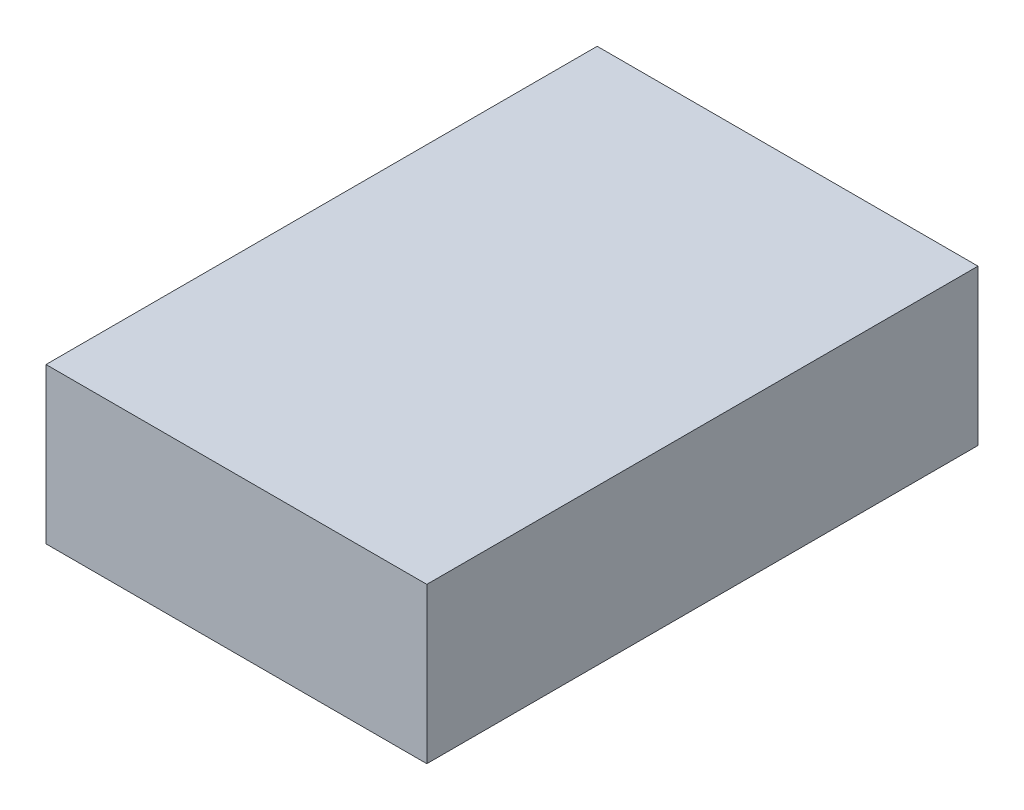
ISO-10303-21;
HEADER;
FILE_DESCRIPTION(('STEP AP214'),'2;1');
FILE_NAME('part.step','',(''),(''),'','','');
FILE_SCHEMA(('AUTOMOTIVE_DESIGN { 1 0 10303 214 1 1 1 1 }'));
ENDSEC;
DATA;
#1=APPLICATION_CONTEXT('core data for automotive mechanical design processes');
#2=APPLICATION_PROTOCOL_DEFINITION('international standard','automotive_design',2000,#1);
#3=PRODUCT_CONTEXT('',#1,'mechanical');
#4=PRODUCT('Part','Part','',(#3));
#5=PRODUCT_RELATED_PRODUCT_CATEGORY('part','',(#4));
#6=PRODUCT_DEFINITION_FORMATION('','',#4);
#7=PRODUCT_DEFINITION_CONTEXT('part definition',#1,'design');
#8=PRODUCT_DEFINITION('design','',#6,#7);
#9=PRODUCT_DEFINITION_SHAPE('','',#8);
#10=(LENGTH_UNIT() NAMED_UNIT(*) SI_UNIT(.MILLI.,.METRE.));
#11=(NAMED_UNIT(*) PLANE_ANGLE_UNIT() SI_UNIT($,.RADIAN.));
#12=(NAMED_UNIT(*) SI_UNIT($,.STERADIAN.) SOLID_ANGLE_UNIT());
#13=UNCERTAINTY_MEASURE_WITH_UNIT(LENGTH_MEASURE(1.E-05),#10,'distance_accuracy_value','');
#14=(GEOMETRIC_REPRESENTATION_CONTEXT(3) GLOBAL_UNCERTAINTY_ASSIGNED_CONTEXT((#13)) GLOBAL_UNIT_ASSIGNED_CONTEXT((#10,
#11,#12)) REPRESENTATION_CONTEXT('',''));
#15=CARTESIAN_POINT('',(0.,0.,0.));
#16=DIRECTION('',(0.,0.,1.));
#17=DIRECTION('',(1.,0.,0.));
#18=AXIS2_PLACEMENT_3D('',#15,#16,#17);
#19=CARTESIAN_POINT('',(-19.,15.4999944,27.5));
#20=DIRECTION('',(-1.,0.,0.));
#21=DIRECTION('',(0.,0.,1.));
#22=AXIS2_PLACEMENT_3D('',#19,#20,#21);
#23=PLANE('',#22);
#24=DIRECTION('',(0.,0.,-1.));
#25=VECTOR('',#24,1.);
#26=CARTESIAN_POINT('',(-19.,0.,27.5));
#27=LINE('',#26,#25);
#28=CARTESIAN_POINT('',(-19.,0.,27.5));
#29=VERTEX_POINT('',#28);
#30=CARTESIAN_POINT('',(-19.,0.,-27.5));
#31=VERTEX_POINT('',#30);
#32=EDGE_CURVE('E110',#29,#31,#27,.T.);
#33=ORIENTED_EDGE('',*,*,#32,.F.);
#34=DIRECTION('',(0.,-1.,0.));
#35=VECTOR('',#34,1.);
#36=CARTESIAN_POINT('',(-19.,15.4999944,27.5));
#37=LINE('',#36,#35);
#38=CARTESIAN_POINT('',(-19.,15.4999944,27.5));
#39=VERTEX_POINT('',#38);
#40=EDGE_CURVE('E11',#39,#29,#37,.T.);
#41=ORIENTED_EDGE('',*,*,#40,.F.);
#42=DIRECTION('',(0.,0.,-1.));
#43=VECTOR('',#42,1.);
#44=CARTESIAN_POINT('',(-19.,15.4999944,27.5));
#45=LINE('',#44,#43);
#46=CARTESIAN_POINT('',(-19.,15.4999944,-27.5));
#47=VERTEX_POINT('',#46);
#48=EDGE_CURVE('E103',#39,#47,#45,.T.);
#49=ORIENTED_EDGE('',*,*,#48,.T.);
#50=DIRECTION('',(0.,-1.,0.));
#51=VECTOR('',#50,1.);
#52=CARTESIAN_POINT('',(-19.,15.4999944,-27.5));
#53=LINE('',#52,#51);
#54=EDGE_CURVE('E42',#47,#31,#53,.T.);
#55=ORIENTED_EDGE('',*,*,#54,.T.);
#56=EDGE_LOOP('',(#33,#41,#49,#55));
#57=FACE_BOUND('',#56,.T.);
#58=ADVANCED_FACE('F39',(#57),#23,.T.);
#59=CARTESIAN_POINT('',(-19.,15.4999944,27.5));
#60=DIRECTION('',(0.,0.,-1.));
#61=DIRECTION('',(-1.,0.,0.));
#62=AXIS2_PLACEMENT_3D('',#59,#60,#61);
#63=PLANE('',#62);
#64=DIRECTION('',(1.,0.,0.));
#65=VECTOR('',#64,1.);
#66=CARTESIAN_POINT('',(-19.,0.,27.5));
#67=LINE('',#66,#65);
#68=CARTESIAN_POINT('',(19.,0.,27.5));
#69=VERTEX_POINT('',#68);
#70=EDGE_CURVE('E73',#29,#69,#67,.T.);
#71=ORIENTED_EDGE('',*,*,#70,.T.);
#72=DIRECTION('',(0.,-1.,0.));
#73=VECTOR('',#72,1.);
#74=CARTESIAN_POINT('',(19.,15.4999944,27.5));
#75=LINE('',#74,#73);
#76=CARTESIAN_POINT('',(19.,15.4999944,27.5));
#77=VERTEX_POINT('',#76);
#78=EDGE_CURVE('E49',#77,#69,#75,.T.);
#79=ORIENTED_EDGE('',*,*,#78,.F.);
#80=DIRECTION('',(1.,0.,0.));
#81=VECTOR('',#80,1.);
#82=CARTESIAN_POINT('',(-19.,15.4999944,27.5));
#83=LINE('',#82,#81);
#84=EDGE_CURVE('E90',#39,#77,#83,.T.);
#85=ORIENTED_EDGE('',*,*,#84,.F.);
#86=ORIENTED_EDGE('',*,*,#40,.T.);
#87=EDGE_LOOP('',(#71,#79,#85,#86));
#88=FACE_BOUND('',#87,.T.);
#89=ADVANCED_FACE('F126',(#88),#63,.F.);
#90=CARTESIAN_POINT('',(19.,15.4999944,27.5));
#91=DIRECTION('',(-1.,0.,0.));
#92=DIRECTION('',(0.,0.,1.));
#93=AXIS2_PLACEMENT_3D('',#90,#91,#92);
#94=PLANE('',#93);
#95=DIRECTION('',(0.,0.,-1.));
#96=VECTOR('',#95,1.);
#97=CARTESIAN_POINT('',(19.,0.,27.5));
#98=LINE('',#97,#96);
#99=CARTESIAN_POINT('',(19.,0.,-27.5));
#100=VERTEX_POINT('',#99);
#101=EDGE_CURVE('E98',#69,#100,#98,.T.);
#102=ORIENTED_EDGE('',*,*,#101,.T.);
#103=DIRECTION('',(0.,-1.,0.));
#104=VECTOR('',#103,1.);
#105=CARTESIAN_POINT('',(19.,15.4999944,-27.5));
#106=LINE('',#105,#104);
#107=CARTESIAN_POINT('',(19.,15.4999944,-27.5));
#108=VERTEX_POINT('',#107);
#109=EDGE_CURVE('E95',#108,#100,#106,.T.);
#110=ORIENTED_EDGE('',*,*,#109,.F.);
#111=DIRECTION('',(0.,0.,-1.));
#112=VECTOR('',#111,1.);
#113=CARTESIAN_POINT('',(19.,15.4999944,27.5));
#114=LINE('',#113,#112);
#115=EDGE_CURVE('E85',#77,#108,#114,.T.);
#116=ORIENTED_EDGE('',*,*,#115,.F.);
#117=ORIENTED_EDGE('',*,*,#78,.T.);
#118=EDGE_LOOP('',(#102,#110,#116,#117));
#119=FACE_BOUND('',#118,.T.);
#120=ADVANCED_FACE('F96',(#119),#94,.F.);
#121=CARTESIAN_POINT('',(-19.,15.4999944,-27.5));
#122=DIRECTION('',(0.,0.,-1.));
#123=DIRECTION('',(-1.,0.,0.));
#124=AXIS2_PLACEMENT_3D('',#121,#122,#123);
#125=PLANE('',#124);
#126=DIRECTION('',(1.,0.,0.));
#127=VECTOR('',#126,1.);
#128=CARTESIAN_POINT('',(-19.,0.,-27.5));
#129=LINE('',#128,#127);
#130=EDGE_CURVE('E114',#31,#100,#129,.T.);
#131=ORIENTED_EDGE('',*,*,#130,.F.);
#132=ORIENTED_EDGE('',*,*,#54,.F.);
#133=DIRECTION('',(1.,0.,0.));
#134=VECTOR('',#133,1.);
#135=CARTESIAN_POINT('',(-19.,15.4999944,-27.5));
#136=LINE('',#135,#134);
#137=EDGE_CURVE('E89',#47,#108,#136,.T.);
#138=ORIENTED_EDGE('',*,*,#137,.T.);
#139=ORIENTED_EDGE('',*,*,#109,.T.);
#140=EDGE_LOOP('',(#131,#132,#138,#139));
#141=FACE_BOUND('',#140,.T.);
#142=ADVANCED_FACE('F101',(#141),#125,.T.);
#143=CARTESIAN_POINT('',(0.,15.4999944,0.));
#144=DIRECTION('',(0.,-1.,0.));
#145=DIRECTION('',(0.,0.,-1.));
#146=AXIS2_PLACEMENT_3D('',#143,#144,#145);
#147=PLANE('',#146);
#148=ORIENTED_EDGE('',*,*,#48,.F.);
#149=ORIENTED_EDGE('',*,*,#84,.T.);
#150=ORIENTED_EDGE('',*,*,#115,.T.);
#151=ORIENTED_EDGE('',*,*,#137,.F.);
#152=EDGE_LOOP('',(#148,#149,#150,#151));
#153=FACE_BOUND('',#152,.T.);
#154=ADVANCED_FACE('F88',(#153),#147,.F.);
#155=CARTESIAN_POINT('',(0.,0.,0.));
#156=DIRECTION('',(0.,-1.,0.));
#157=DIRECTION('',(0.,0.,-1.));
#158=AXIS2_PLACEMENT_3D('',#155,#156,#157);
#159=PLANE('',#158);
#160=ORIENTED_EDGE('',*,*,#32,.T.);
#161=ORIENTED_EDGE('',*,*,#130,.T.);
#162=ORIENTED_EDGE('',*,*,#101,.F.);
#163=ORIENTED_EDGE('',*,*,#70,.F.);
#164=EDGE_LOOP('',(#160,#161,#162,#163));
#165=FACE_BOUND('',#164,.T.);
#166=ADVANCED_FACE('F123',(#165),#159,.T.);
#167=CLOSED_SHELL('',(#58,#89,#120,#142,#154,#166));
#168=MANIFOLD_SOLID_BREP('B2',#167);
#169=ADVANCED_BREP_SHAPE_REPRESENTATION('',(#18,#168),#14);
#170=SHAPE_DEFINITION_REPRESENTATION(#9,#169);
ENDSEC;
END-ISO-10303-21;
